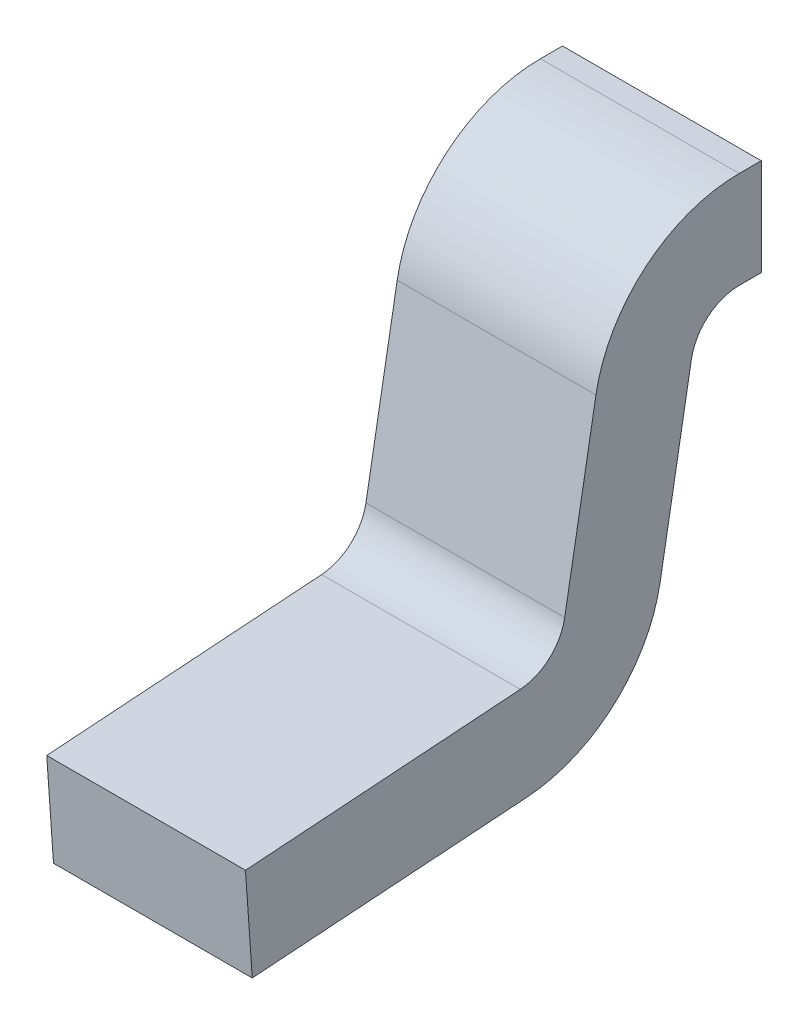
ISO-10303-21;
HEADER;
FILE_DESCRIPTION(('STEP AP214'),'2;1');
FILE_NAME('part.step','',(''),(''),'','','');
FILE_SCHEMA(('AUTOMOTIVE_DESIGN { 1 0 10303 214 1 1 1 1 }'));
ENDSEC;
DATA;
#1=APPLICATION_CONTEXT('core data for automotive mechanical design processes');
#2=APPLICATION_PROTOCOL_DEFINITION('international standard','automotive_design',2000,#1);
#3=PRODUCT_CONTEXT('',#1,'mechanical');
#4=PRODUCT('Part','Part','',(#3));
#5=PRODUCT_RELATED_PRODUCT_CATEGORY('part','',(#4));
#6=PRODUCT_DEFINITION_FORMATION('','',#4);
#7=PRODUCT_DEFINITION_CONTEXT('part definition',#1,'design');
#8=PRODUCT_DEFINITION('design','',#6,#7);
#9=PRODUCT_DEFINITION_SHAPE('','',#8);
#10=(LENGTH_UNIT() NAMED_UNIT(*) SI_UNIT(.MILLI.,.METRE.));
#11=(NAMED_UNIT(*) PLANE_ANGLE_UNIT() SI_UNIT($,.RADIAN.));
#12=(NAMED_UNIT(*) SI_UNIT($,.STERADIAN.) SOLID_ANGLE_UNIT());
#13=UNCERTAINTY_MEASURE_WITH_UNIT(LENGTH_MEASURE(1.E-05),#10,'distance_accuracy_value','');
#14=(GEOMETRIC_REPRESENTATION_CONTEXT(3) GLOBAL_UNCERTAINTY_ASSIGNED_CONTEXT((#13)) GLOBAL_UNIT_ASSIGNED_CONTEXT((#10,
#11,#12)) REPRESENTATION_CONTEXT('',''));
#15=CARTESIAN_POINT('',(0.,0.,0.));
#16=DIRECTION('',(0.,0.,1.));
#17=DIRECTION('',(1.,0.,0.));
#18=AXIS2_PLACEMENT_3D('',#15,#16,#17);
#19=CARTESIAN_POINT('',(0.205,0.,0.));
#20=DIRECTION('',(1.,0.,0.));
#21=DIRECTION('',(0.,0.,-1.));
#22=AXIS2_PLACEMENT_3D('',#19,#20,#21);
#23=PLANE('',#22);
#24=DIRECTION('',(0.,0.,1.));
#25=VECTOR('',#24,1.);
#26=CARTESIAN_POINT('',(0.205,0.685,-0.215));
#27=LINE('',#26,#25);
#28=CARTESIAN_POINT('',(0.205,0.685,-0.169428548761));
#29=VERTEX_POINT('',#28);
#30=CARTESIAN_POINT('',(0.205,0.685,-0.215));
#31=VERTEX_POINT('',#30);
#32=EDGE_CURVE('E116',#29,#31,#27,.F.);
#33=ORIENTED_EDGE('',*,*,#32,.F.);
#34=CARTESIAN_POINT('',(0.205,0.385,-0.169428548761));
#35=DIRECTION('',(-1.,0.,0.));
#36=DIRECTION('',(0.,0.,1.));
#37=AXIS2_PLACEMENT_3D('',#34,#35,#36);
#38=CIRCLE('',#37,0.3);
#39=CARTESIAN_POINT('',(0.205,0.437094453299973,0.126013777141863));
#40=VERTEX_POINT('',#39);
#41=EDGE_CURVE('E20',#40,#29,#38,.T.);
#42=ORIENTED_EDGE('',*,*,#41,.F.);
#43=DIRECTION('',(0.,-0.98480775301219,0.173648177667033));
#44=VECTOR('',#43,1.);
#45=CARTESIAN_POINT('',(0.205,0.03472963553339,0.196961550602));
#46=LINE('',#45,#44);
#47=CARTESIAN_POINT('',(0.205,0.0715513103137367,0.190468895863569));
#48=VERTEX_POINT('',#47);
#49=EDGE_CURVE('E101',#48,#40,#46,.F.);
#50=ORIENTED_EDGE('',*,*,#49,.F.);
#51=CARTESIAN_POINT('',(0.205,0.08891612808049,0.288949671165));
#52=DIRECTION('',(1.,0.,0.));
#53=DIRECTION('',(0.,0.,-1.));
#54=AXIS2_PLACEMENT_3D('',#51,#52,#53);
#55=CIRCLE('',#54,0.1);
#56=CARTESIAN_POINT('',(0.205,-0.010840276945494,0.281974023790794));
#57=VERTEX_POINT('',#56);
#58=EDGE_CURVE('E124',#48,#57,#55,.F.);
#59=ORIENTED_EDGE('',*,*,#58,.T.);
#60=DIRECTION('',(0.,-0.0697564737441177,0.997564050259825));
#61=VECTOR('',#60,1.);
#62=CARTESIAN_POINT('',(0.205,-0.005390303916286,0.204035778392));
#63=LINE('',#62,#61);
#64=CARTESIAN_POINT('',(0.205,-0.0504871899480363,0.848951294749));
#65=VERTEX_POINT('',#64);
#66=EDGE_CURVE('E157',#65,#57,#63,.F.);
#67=ORIENTED_EDGE('',*,*,#66,.F.);
#68=DIRECTION('',(0.,-0.997564050259825,-0.0697564737441177));
#69=VECTOR('',#68,1.);
#70=CARTESIAN_POINT('',(0.205,-0.05048718994804,0.848951294749));
#71=LINE('',#70,#69);
#72=CARTESIAN_POINT('',(0.205,-0.250000000000004,0.835000000000059));
#73=VERTEX_POINT('',#72);
#74=EDGE_CURVE('E152',#73,#65,#71,.F.);
#75=ORIENTED_EDGE('',*,*,#74,.F.);
#76=DIRECTION('',(0.,0.0697564737441177,-0.997564050259825));
#77=VECTOR('',#76,1.);
#78=CARTESIAN_POINT('',(0.205,-0.25,0.835));
#79=LINE('',#78,#77);
#80=CARTESIAN_POINT('',(0.205,-0.210353086997467,0.268022729041866));
#81=VERTEX_POINT('',#80);
#82=EDGE_CURVE('E146',#81,#73,#79,.F.);
#83=ORIENTED_EDGE('',*,*,#82,.F.);
#84=CARTESIAN_POINT('',(0.205,0.08891612808049,0.288949671165));
#85=DIRECTION('',(-1.,0.,0.));
#86=DIRECTION('',(0.,0.,1.));
#87=AXIS2_PLACEMENT_3D('',#84,#85,#86);
#88=CIRCLE('',#87,0.3);
#89=CARTESIAN_POINT('',(0.205,0.0368216747803863,-0.00649265473870718));
#90=VERTEX_POINT('',#89);
#91=EDGE_CURVE('E180',#90,#81,#88,.T.);
#92=ORIENTED_EDGE('',*,*,#91,.F.);
#93=DIRECTION('',(0.,0.98480775301219,-0.173648177667033));
#94=VECTOR('',#93,1.);
#95=CARTESIAN_POINT('',(0.205,-0.19400316791,0.03420799284542));
#96=LINE('',#95,#94);
#97=CARTESIAN_POINT('',(0.205,0.402364817766839,-0.0709477734600177));
#98=VERTEX_POINT('',#97);
#99=EDGE_CURVE('E142',#98,#90,#96,.F.);
#100=ORIENTED_EDGE('',*,*,#99,.F.);
#101=CARTESIAN_POINT('',(0.205,0.385,-0.169428548761));
#102=DIRECTION('',(1.,0.,0.));
#103=DIRECTION('',(0.,0.,-1.));
#104=AXIS2_PLACEMENT_3D('',#101,#102,#103);
#105=CIRCLE('',#104,0.1);
#106=CARTESIAN_POINT('',(0.205,0.485,-0.169428548761));
#107=VERTEX_POINT('',#106);
#108=EDGE_CURVE('E139',#98,#107,#105,.F.);
#109=ORIENTED_EDGE('',*,*,#108,.T.);
#110=DIRECTION('',(0.,0.,-1.));
#111=VECTOR('',#110,1.);
#112=CARTESIAN_POINT('',(0.205,0.485,-0.08551858564361));
#113=LINE('',#112,#111);
#114=CARTESIAN_POINT('',(0.205,0.485,-0.215));
#115=VERTEX_POINT('',#114);
#116=EDGE_CURVE('E137',#115,#107,#113,.F.);
#117=ORIENTED_EDGE('',*,*,#116,.F.);
#118=DIRECTION('',(0.,1.,0.));
#119=VECTOR('',#118,1.);
#120=CARTESIAN_POINT('',(0.205,0.485,-0.215));
#121=LINE('',#120,#119);
#122=EDGE_CURVE('E132',#31,#115,#121,.F.);
#123=ORIENTED_EDGE('',*,*,#122,.F.);
#124=EDGE_LOOP('',(#33,#42,#50,#59,#67,#75,#83,#92,#100,#109,#117,#123));
#125=FACE_BOUND('',#124,.T.);
#126=ADVANCED_FACE('F17',(#125),#23,.T.);
#127=CARTESIAN_POINT('',(0.739476,0.385,-0.169428548761));
#128=DIRECTION('',(-1.,0.,0.));
#129=DIRECTION('',(0.,0.,1.));
#130=AXIS2_PLACEMENT_3D('',#127,#128,#129);
#131=CYLINDRICAL_SURFACE('',#130,0.3);
#132=DIRECTION('',(1.,0.,0.));
#133=VECTOR('',#132,1.);
#134=CARTESIAN_POINT('',(-0.205,0.685,-0.169428548761));
#135=LINE('',#134,#133);
#136=CARTESIAN_POINT('',(-0.205,0.685,-0.169428548761));
#137=VERTEX_POINT('',#136);
#138=EDGE_CURVE('E176',#137,#29,#135,.T.);
#139=ORIENTED_EDGE('',*,*,#138,.F.);
#140=CARTESIAN_POINT('',(-0.205,0.385,-0.169428548761));
#141=DIRECTION('',(-1.,0.,0.));
#142=DIRECTION('',(0.,0.,1.));
#143=AXIS2_PLACEMENT_3D('',#140,#141,#142);
#144=CIRCLE('',#143,0.3);
#145=CARTESIAN_POINT('',(-0.205,0.437094453300189,0.126013777141896));
#146=VERTEX_POINT('',#145);
#147=EDGE_CURVE('E122',#137,#146,#144,.F.);
#148=ORIENTED_EDGE('',*,*,#147,.T.);
#149=DIRECTION('',(1.,0.,0.));
#150=VECTOR('',#149,1.);
#151=CARTESIAN_POINT('',(-0.205,0.437094453299976,0.126013777141863));
#152=LINE('',#151,#150);
#153=EDGE_CURVE('E106',#40,#146,#152,.F.);
#154=ORIENTED_EDGE('',*,*,#153,.F.);
#155=ORIENTED_EDGE('',*,*,#41,.T.);
#156=EDGE_LOOP('',(#139,#148,#154,#155));
#157=FACE_BOUND('',#156,.T.);
#158=ADVANCED_FACE('F121',(#157),#131,.T.);
#159=CARTESIAN_POINT('',(-0.205,0.03472963553339,0.196961550602));
#160=DIRECTION('',(0.,0.173648177667033,0.98480775301219));
#161=DIRECTION('',(0.,-0.98480775301219,0.173648177667033));
#162=AXIS2_PLACEMENT_3D('',#159,#160,#161);
#163=PLANE('',#162);
#164=ORIENTED_EDGE('',*,*,#49,.T.);
#165=ORIENTED_EDGE('',*,*,#153,.T.);
#166=DIRECTION('',(0.,-0.98480775301195,0.173648177668395));
#167=VECTOR('',#166,1.);
#168=CARTESIAN_POINT('',(-0.205,0.4370944533,0.126013777142));
#169=LINE('',#168,#167);
#170=CARTESIAN_POINT('',(-0.205,0.0715513103137252,0.190468895863903));
#171=VERTEX_POINT('',#170);
#172=EDGE_CURVE('E174',#146,#171,#169,.T.);
#173=ORIENTED_EDGE('',*,*,#172,.T.);
#174=DIRECTION('',(1.,0.,0.));
#175=VECTOR('',#174,1.);
#176=CARTESIAN_POINT('',(-0.205,0.0715513103137621,0.190468895863785));
#177=LINE('',#176,#175);
#178=EDGE_CURVE('E108',#171,#48,#177,.T.);
#179=ORIENTED_EDGE('',*,*,#178,.T.);
#180=EDGE_LOOP('',(#164,#165,#173,#179));
#181=FACE_BOUND('',#180,.T.);
#182=ADVANCED_FACE('F103',(#181),#163,.T.);
#183=CARTESIAN_POINT('',(-0.205,0.08891612808049,0.288949671165));
#184=DIRECTION('',(1.,0.,0.));
#185=DIRECTION('',(0.,0.,-1.));
#186=AXIS2_PLACEMENT_3D('',#183,#184,#185);
#187=CYLINDRICAL_SURFACE('',#186,0.1);
#188=ORIENTED_EDGE('',*,*,#178,.F.);
#189=CARTESIAN_POINT('',(-0.205,0.08891612808049,0.288949671165));
#190=DIRECTION('',(1.,0.,0.));
#191=DIRECTION('',(0.,0.,-1.));
#192=AXIS2_PLACEMENT_3D('',#189,#190,#191);
#193=CIRCLE('',#192,0.1);
#194=CARTESIAN_POINT('',(-0.205,-0.0108402769454847,0.281974023790792));
#195=VERTEX_POINT('',#194);
#196=EDGE_CURVE('E170',#171,#195,#193,.F.);
#197=ORIENTED_EDGE('',*,*,#196,.T.);
#198=DIRECTION('',(1.,0.,0.));
#199=VECTOR('',#198,1.);
#200=CARTESIAN_POINT('',(-0.205,-0.0108402769455084,0.281974023790999));
#201=LINE('',#200,#199);
#202=EDGE_CURVE('E154',#57,#195,#201,.F.);
#203=ORIENTED_EDGE('',*,*,#202,.F.);
#204=ORIENTED_EDGE('',*,*,#58,.F.);
#205=EDGE_LOOP('',(#188,#197,#203,#204));
#206=FACE_BOUND('',#205,.T.);
#207=ADVANCED_FACE('F186',(#206),#187,.F.);
#208=CARTESIAN_POINT('',(-0.205,-0.005390303916286,0.204035778392));
#209=DIRECTION('',(0.,0.997564050259825,0.0697564737441177));
#210=DIRECTION('',(0.,-0.0697564737441177,0.997564050259825));
#211=AXIS2_PLACEMENT_3D('',#208,#209,#210);
#212=PLANE('',#211);
#213=ORIENTED_EDGE('',*,*,#202,.T.);
#214=DIRECTION('',(0.,-0.0697564737441694,0.997564050259821));
#215=VECTOR('',#214,1.);
#216=CARTESIAN_POINT('',(-0.205,-0.01084027694549,0.281974023791));
#217=LINE('',#216,#215);
#218=CARTESIAN_POINT('',(-0.205,-0.05048718994804,0.848951294749));
#219=VERTEX_POINT('',#218);
#220=EDGE_CURVE('E173',#195,#219,#217,.T.);
#221=ORIENTED_EDGE('',*,*,#220,.T.);
#222=DIRECTION('',(1.,0.,0.));
#223=VECTOR('',#222,1.);
#224=CARTESIAN_POINT('',(-0.205,-0.05048718994804,0.848951294749));
#225=LINE('',#224,#223);
#226=EDGE_CURVE('E149',#65,#219,#225,.F.);
#227=ORIENTED_EDGE('',*,*,#226,.F.);
#228=ORIENTED_EDGE('',*,*,#66,.T.);
#229=EDGE_LOOP('',(#213,#221,#227,#228));
#230=FACE_BOUND('',#229,.T.);
#231=ADVANCED_FACE('F263',(#230),#212,.T.);
#232=CARTESIAN_POINT('',(-0.205,-0.05048718994804,0.848951294749));
#233=DIRECTION('',(0.,-0.0697564737441177,0.997564050259825));
#234=DIRECTION('',(0.,-0.997564050259825,-0.0697564737441177));
#235=AXIS2_PLACEMENT_3D('',#232,#233,#234);
#236=PLANE('',#235);
#237=ORIENTED_EDGE('',*,*,#226,.T.);
#238=DIRECTION('',(0.,-0.997564050259763,-0.0697564737449972));
#239=VECTOR('',#238,1.);
#240=CARTESIAN_POINT('',(-0.205,-0.05048718994804,0.848951294749));
#241=LINE('',#240,#239);
#242=CARTESIAN_POINT('',(-0.205,-0.25,0.835));
#243=VERTEX_POINT('',#242);
#244=EDGE_CURVE('E197',#219,#243,#241,.T.);
#245=ORIENTED_EDGE('',*,*,#244,.T.);
#246=DIRECTION('',(1.,0.,0.));
#247=VECTOR('',#246,1.);
#248=CARTESIAN_POINT('',(-0.205,-0.25,0.835));
#249=LINE('',#248,#247);
#250=EDGE_CURVE('E148',#73,#243,#249,.F.);
#251=ORIENTED_EDGE('',*,*,#250,.F.);
#252=ORIENTED_EDGE('',*,*,#74,.T.);
#253=EDGE_LOOP('',(#237,#245,#251,#252));
#254=FACE_BOUND('',#253,.T.);
#255=ADVANCED_FACE('F262',(#254),#236,.T.);
#256=CARTESIAN_POINT('',(-0.205,-0.25,0.835));
#257=DIRECTION('',(0.,-0.997564050259825,-0.0697564737441177));
#258=DIRECTION('',(0.,0.0697564737441177,-0.997564050259825));
#259=AXIS2_PLACEMENT_3D('',#256,#257,#258);
#260=PLANE('',#259);
#261=ORIENTED_EDGE('',*,*,#250,.T.);
#262=DIRECTION('',(0.,0.0697564737449573,-0.997564050259766));
#263=VECTOR('',#262,1.);
#264=CARTESIAN_POINT('',(-0.205,-0.25,0.835));
#265=LINE('',#264,#263);
#266=CARTESIAN_POINT('',(-0.205,-0.21035308699722,0.268022729041756));
#267=VERTEX_POINT('',#266);
#268=EDGE_CURVE('E169',#243,#267,#265,.T.);
#269=ORIENTED_EDGE('',*,*,#268,.T.);
#270=DIRECTION('',(-1.,0.,0.));
#271=VECTOR('',#270,1.);
#272=CARTESIAN_POINT('',(-0.205,-0.210353086997472,0.268022729041967));
#273=LINE('',#272,#271);
#274=EDGE_CURVE('E145',#81,#267,#273,.T.);
#275=ORIENTED_EDGE('',*,*,#274,.F.);
#276=ORIENTED_EDGE('',*,*,#82,.T.);
#277=EDGE_LOOP('',(#261,#269,#275,#276));
#278=FACE_BOUND('',#277,.T.);
#279=ADVANCED_FACE('F258',(#278),#260,.T.);
#280=CARTESIAN_POINT('',(-0.205,0.08891612808049,0.288949671165));
#281=DIRECTION('',(-1.,0.,0.));
#282=DIRECTION('',(0.,0.,1.));
#283=AXIS2_PLACEMENT_3D('',#280,#281,#282);
#284=CYLINDRICAL_SURFACE('',#283,0.3);
#285=CARTESIAN_POINT('',(-0.205,0.08891612808049,0.288949671165));
#286=DIRECTION('',(-1.,0.,0.));
#287=DIRECTION('',(0.,0.,1.));
#288=AXIS2_PLACEMENT_3D('',#285,#286,#287);
#289=CIRCLE('',#288,0.3);
#290=CARTESIAN_POINT('',(-0.205,0.0368216747804287,-0.0064926547386884));
#291=VERTEX_POINT('',#290);
#292=EDGE_CURVE('E166',#267,#291,#289,.F.);
#293=ORIENTED_EDGE('',*,*,#292,.T.);
#294=DIRECTION('',(1.,0.,0.));
#295=VECTOR('',#294,1.);
#296=CARTESIAN_POINT('',(-0.205,0.0368216747804011,-0.00649265473870974));
#297=LINE('',#296,#295);
#298=EDGE_CURVE('E144',#90,#291,#297,.F.);
#299=ORIENTED_EDGE('',*,*,#298,.F.);
#300=ORIENTED_EDGE('',*,*,#91,.T.);
#301=ORIENTED_EDGE('',*,*,#274,.T.);
#302=EDGE_LOOP('',(#293,#299,#300,#301));
#303=FACE_BOUND('',#302,.T.);
#304=ADVANCED_FACE('F254',(#303),#284,.T.);
#305=CARTESIAN_POINT('',(-0.205,-0.19400316791,0.03420799284542));
#306=DIRECTION('',(0.,-0.173648177667033,-0.98480775301219));
#307=DIRECTION('',(0.,0.98480775301219,-0.173648177667033));
#308=AXIS2_PLACEMENT_3D('',#305,#306,#307);
#309=PLANE('',#308);
#310=DIRECTION('',(0.,0.984807753012234,-0.173648177666781));
#311=VECTOR('',#310,1.);
#312=CARTESIAN_POINT('',(-0.205,0.03682167478041,-0.006492654738659));
#313=LINE('',#312,#311);
#314=CARTESIAN_POINT('',(-0.205,0.402364817766839,-0.0709477734599433));
#315=VERTEX_POINT('',#314);
#316=EDGE_CURVE('E165',#291,#315,#313,.T.);
#317=ORIENTED_EDGE('',*,*,#316,.T.);
#318=DIRECTION('',(1.,0.,0.));
#319=VECTOR('',#318,1.);
#320=CARTESIAN_POINT('',(-0.739476,0.402364817767047,-0.0709477734598416));
#321=LINE('',#320,#319);
#322=EDGE_CURVE('E179',#315,#98,#321,.T.);
#323=ORIENTED_EDGE('',*,*,#322,.T.);
#324=ORIENTED_EDGE('',*,*,#99,.T.);
#325=ORIENTED_EDGE('',*,*,#298,.T.);
#326=EDGE_LOOP('',(#317,#323,#324,#325));
#327=FACE_BOUND('',#326,.T.);
#328=ADVANCED_FACE('F248',(#327),#309,.T.);
#329=CARTESIAN_POINT('',(-0.739476,0.385,-0.169428548761));
#330=DIRECTION('',(1.,0.,0.));
#331=DIRECTION('',(0.,0.,-1.));
#332=AXIS2_PLACEMENT_3D('',#329,#330,#331);
#333=CYLINDRICAL_SURFACE('',#332,0.1);
#334=ORIENTED_EDGE('',*,*,#322,.F.);
#335=CARTESIAN_POINT('',(-0.205,0.385,-0.169428548761));
#336=DIRECTION('',(1.,0.,0.));
#337=DIRECTION('',(0.,0.,-1.));
#338=AXIS2_PLACEMENT_3D('',#335,#336,#337);
#339=CIRCLE('',#338,0.1);
#340=CARTESIAN_POINT('',(-0.205,0.485,-0.169428548761));
#341=VERTEX_POINT('',#340);
#342=EDGE_CURVE('E161',#315,#341,#339,.F.);
#343=ORIENTED_EDGE('',*,*,#342,.T.);
#344=DIRECTION('',(1.,0.,0.));
#345=VECTOR('',#344,1.);
#346=CARTESIAN_POINT('',(-0.205,0.485,-0.169428548761));
#347=LINE('',#346,#345);
#348=EDGE_CURVE('E134',#107,#341,#347,.F.);
#349=ORIENTED_EDGE('',*,*,#348,.F.);
#350=ORIENTED_EDGE('',*,*,#108,.F.);
#351=EDGE_LOOP('',(#334,#343,#349,#350));
#352=FACE_BOUND('',#351,.T.);
#353=ADVANCED_FACE('F245',(#352),#333,.F.);
#354=CARTESIAN_POINT('',(-0.205,0.485,-0.08551858564361));
#355=DIRECTION('',(0.,-1.,0.));
#356=DIRECTION('',(0.,0.,-1.));
#357=AXIS2_PLACEMENT_3D('',#354,#355,#356);
#358=PLANE('',#357);
#359=ORIENTED_EDGE('',*,*,#116,.T.);
#360=ORIENTED_EDGE('',*,*,#348,.T.);
#361=DIRECTION('',(0.,0.,-1.));
#362=VECTOR('',#361,1.);
#363=CARTESIAN_POINT('',(-0.205,0.485,0.));
#364=LINE('',#363,#362);
#365=CARTESIAN_POINT('',(-0.205,0.485,-0.215));
#366=VERTEX_POINT('',#365);
#367=EDGE_CURVE('E164',#341,#366,#364,.T.);
#368=ORIENTED_EDGE('',*,*,#367,.T.);
#369=DIRECTION('',(-1.,0.,0.));
#370=VECTOR('',#369,1.);
#371=CARTESIAN_POINT('',(-0.205,0.485,-0.215));
#372=LINE('',#371,#370);
#373=EDGE_CURVE('E129',#115,#366,#372,.T.);
#374=ORIENTED_EDGE('',*,*,#373,.F.);
#375=EDGE_LOOP('',(#359,#360,#368,#374));
#376=FACE_BOUND('',#375,.T.);
#377=ADVANCED_FACE('F237',(#376),#358,.T.);
#378=CARTESIAN_POINT('',(-0.205,0.485,-0.215));
#379=DIRECTION('',(0.,0.,-1.));
#380=DIRECTION('',(-1.,0.,0.));
#381=AXIS2_PLACEMENT_3D('',#378,#379,#380);
#382=PLANE('',#381);
#383=ORIENTED_EDGE('',*,*,#373,.T.);
#384=DIRECTION('',(0.,1.,0.));
#385=VECTOR('',#384,1.);
#386=CARTESIAN_POINT('',(-0.205,0.,-0.215));
#387=LINE('',#386,#385);
#388=CARTESIAN_POINT('',(-0.205,0.685,-0.215));
#389=VERTEX_POINT('',#388);
#390=EDGE_CURVE('E26',#366,#389,#387,.T.);
#391=ORIENTED_EDGE('',*,*,#390,.T.);
#392=DIRECTION('',(1.,0.,0.));
#393=VECTOR('',#392,1.);
#394=CARTESIAN_POINT('',(-0.205,0.685,-0.215));
#395=LINE('',#394,#393);
#396=EDGE_CURVE('E34',#31,#389,#395,.F.);
#397=ORIENTED_EDGE('',*,*,#396,.F.);
#398=ORIENTED_EDGE('',*,*,#122,.T.);
#399=EDGE_LOOP('',(#383,#391,#397,#398));
#400=FACE_BOUND('',#399,.T.);
#401=ADVANCED_FACE('F266',(#400),#382,.T.);
#402=CARTESIAN_POINT('',(-0.205,0.685,-0.215));
#403=DIRECTION('',(0.,1.,0.));
#404=DIRECTION('',(0.,0.,1.));
#405=AXIS2_PLACEMENT_3D('',#402,#403,#404);
#406=PLANE('',#405);
#407=DIRECTION('',(0.,0.,-1.));
#408=VECTOR('',#407,1.);
#409=CARTESIAN_POINT('',(-0.205,0.685,0.));
#410=LINE('',#409,#408);
#411=EDGE_CURVE('E11',#389,#137,#410,.F.);
#412=ORIENTED_EDGE('',*,*,#411,.T.);
#413=ORIENTED_EDGE('',*,*,#138,.T.);
#414=ORIENTED_EDGE('',*,*,#32,.T.);
#415=ORIENTED_EDGE('',*,*,#396,.T.);
#416=EDGE_LOOP('',(#412,#413,#414,#415));
#417=FACE_BOUND('',#416,.T.);
#418=ADVANCED_FACE('F264',(#417),#406,.T.);
#419=CARTESIAN_POINT('',(-0.205,0.,0.));
#420=DIRECTION('',(1.,0.,0.));
#421=DIRECTION('',(0.,0.,-1.));
#422=AXIS2_PLACEMENT_3D('',#419,#420,#421);
#423=PLANE('',#422);
#424=ORIENTED_EDGE('',*,*,#390,.F.);
#425=ORIENTED_EDGE('',*,*,#367,.F.);
#426=ORIENTED_EDGE('',*,*,#342,.F.);
#427=ORIENTED_EDGE('',*,*,#316,.F.);
#428=ORIENTED_EDGE('',*,*,#292,.F.);
#429=ORIENTED_EDGE('',*,*,#268,.F.);
#430=ORIENTED_EDGE('',*,*,#244,.F.);
#431=ORIENTED_EDGE('',*,*,#220,.F.);
#432=ORIENTED_EDGE('',*,*,#196,.F.);
#433=ORIENTED_EDGE('',*,*,#172,.F.);
#434=ORIENTED_EDGE('',*,*,#147,.F.);
#435=ORIENTED_EDGE('',*,*,#411,.F.);
#436=EDGE_LOOP('',(#424,#425,#426,#427,#428,#429,#430,#431,#432,#433,#434,#435));
#437=FACE_BOUND('',#436,.T.);
#438=ADVANCED_FACE('F242',(#437),#423,.F.);
#439=CLOSED_SHELL('',(#126,#158,#182,#207,#231,#255,#279,#304,#328,#353,#377,#401,#418,#438));
#440=MANIFOLD_SOLID_BREP('B1',#439);
#441=ADVANCED_BREP_SHAPE_REPRESENTATION('',(#18,#440),#14);
#442=SHAPE_DEFINITION_REPRESENTATION(#9,#441);
ENDSEC;
END-ISO-10303-21;
